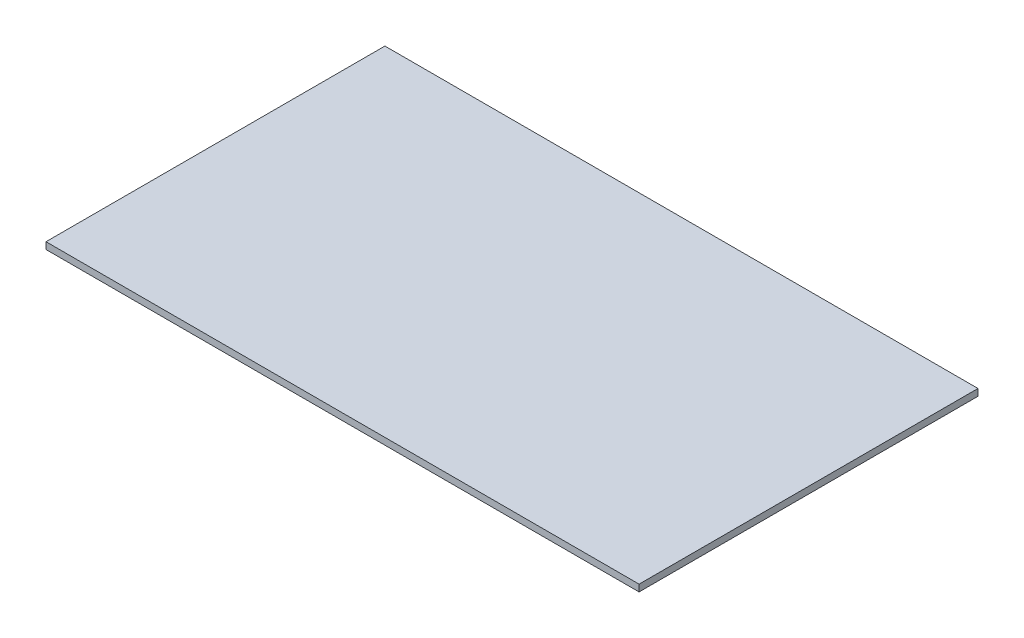
ISO-10303-21;
HEADER;
FILE_DESCRIPTION(('STEP AP214'),'2;1');
FILE_NAME('part.step','',(''),(''),'','','');
FILE_SCHEMA(('AUTOMOTIVE_DESIGN { 1 0 10303 214 1 1 1 1 }'));
ENDSEC;
DATA;
#1=APPLICATION_CONTEXT('core data for automotive mechanical design processes');
#2=APPLICATION_PROTOCOL_DEFINITION('international standard','automotive_design',2000,#1);
#3=PRODUCT_CONTEXT('',#1,'mechanical');
#4=PRODUCT('Part','Part','',(#3));
#5=PRODUCT_RELATED_PRODUCT_CATEGORY('part','',(#4));
#6=PRODUCT_DEFINITION_FORMATION('','',#4);
#7=PRODUCT_DEFINITION_CONTEXT('part definition',#1,'design');
#8=PRODUCT_DEFINITION('design','',#6,#7);
#9=PRODUCT_DEFINITION_SHAPE('','',#8);
#10=(LENGTH_UNIT() NAMED_UNIT(*) SI_UNIT(.MILLI.,.METRE.));
#11=(NAMED_UNIT(*) PLANE_ANGLE_UNIT() SI_UNIT($,.RADIAN.));
#12=(NAMED_UNIT(*) SI_UNIT($,.STERADIAN.) SOLID_ANGLE_UNIT());
#13=UNCERTAINTY_MEASURE_WITH_UNIT(LENGTH_MEASURE(1.E-05),#10,'distance_accuracy_value','');
#14=(GEOMETRIC_REPRESENTATION_CONTEXT(3) GLOBAL_UNCERTAINTY_ASSIGNED_CONTEXT((#13)) GLOBAL_UNIT_ASSIGNED_CONTEXT((#10,
#11,#12)) REPRESENTATION_CONTEXT('',''));
#15=CARTESIAN_POINT('',(0.,0.,0.));
#16=DIRECTION('',(0.,0.,1.));
#17=DIRECTION('',(1.,0.,0.));
#18=AXIS2_PLACEMENT_3D('',#15,#16,#17);
#19=CARTESIAN_POINT('',(-35.,0.8,-20.));
#20=DIRECTION('',(1.,0.,0.));
#21=DIRECTION('',(0.,0.,-1.));
#22=AXIS2_PLACEMENT_3D('',#19,#20,#21);
#23=PLANE('',#22);
#24=DIRECTION('',(0.,0.,1.));
#25=VECTOR('',#24,1.);
#26=CARTESIAN_POINT('',(-35.,0.,-20.));
#27=LINE('',#26,#25);
#28=CARTESIAN_POINT('',(-35.,0.,-20.));
#29=VERTEX_POINT('',#28);
#30=CARTESIAN_POINT('',(-35.,0.,20.));
#31=VERTEX_POINT('',#30);
#32=EDGE_CURVE('E101',#29,#31,#27,.T.);
#33=ORIENTED_EDGE('',*,*,#32,.T.);
#34=DIRECTION('',(0.,-1.,0.));
#35=VECTOR('',#34,1.);
#36=CARTESIAN_POINT('',(-35.,0.8,20.));
#37=LINE('',#36,#35);
#38=CARTESIAN_POINT('',(-35.,0.8,20.));
#39=VERTEX_POINT('',#38);
#40=EDGE_CURVE('E11',#39,#31,#37,.T.);
#41=ORIENTED_EDGE('',*,*,#40,.F.);
#42=DIRECTION('',(0.,0.,1.));
#43=VECTOR('',#42,1.);
#44=CARTESIAN_POINT('',(-35.,0.8,-20.));
#45=LINE('',#44,#43);
#46=CARTESIAN_POINT('',(-35.,0.8,-20.));
#47=VERTEX_POINT('',#46);
#48=EDGE_CURVE('E89',#47,#39,#45,.T.);
#49=ORIENTED_EDGE('',*,*,#48,.F.);
#50=DIRECTION('',(0.,-1.,0.));
#51=VECTOR('',#50,1.);
#52=CARTESIAN_POINT('',(-35.,0.8,-20.));
#53=LINE('',#52,#51);
#54=EDGE_CURVE('E97',#47,#29,#53,.T.);
#55=ORIENTED_EDGE('',*,*,#54,.T.);
#56=EDGE_LOOP('',(#33,#41,#49,#55));
#57=FACE_BOUND('',#56,.T.);
#58=ADVANCED_FACE('F38',(#57),#23,.F.);
#59=CARTESIAN_POINT('',(-35.,0.8,20.));
#60=DIRECTION('',(0.,0.,-1.));
#61=DIRECTION('',(-1.,0.,0.));
#62=AXIS2_PLACEMENT_3D('',#59,#60,#61);
#63=PLANE('',#62);
#64=DIRECTION('',(1.,0.,0.));
#65=VECTOR('',#64,1.);
#66=CARTESIAN_POINT('',(-35.,0.,20.));
#67=LINE('',#66,#65);
#68=CARTESIAN_POINT('',(35.,0.,20.));
#69=VERTEX_POINT('',#68);
#70=EDGE_CURVE('E93',#31,#69,#67,.T.);
#71=ORIENTED_EDGE('',*,*,#70,.T.);
#72=DIRECTION('',(0.,-1.,0.));
#73=VECTOR('',#72,1.);
#74=CARTESIAN_POINT('',(35.,0.8,20.));
#75=LINE('',#74,#73);
#76=CARTESIAN_POINT('',(35.,0.8,20.));
#77=VERTEX_POINT('',#76);
#78=EDGE_CURVE('E46',#77,#69,#75,.T.);
#79=ORIENTED_EDGE('',*,*,#78,.F.);
#80=DIRECTION('',(1.,0.,0.));
#81=VECTOR('',#80,1.);
#82=CARTESIAN_POINT('',(-35.,0.8,20.));
#83=LINE('',#82,#81);
#84=EDGE_CURVE('E84',#39,#77,#83,.T.);
#85=ORIENTED_EDGE('',*,*,#84,.F.);
#86=ORIENTED_EDGE('',*,*,#40,.T.);
#87=EDGE_LOOP('',(#71,#79,#85,#86));
#88=FACE_BOUND('',#87,.T.);
#89=ADVANCED_FACE('F92',(#88),#63,.F.);
#90=CARTESIAN_POINT('',(35.,0.8,-20.));
#91=DIRECTION('',(-1.,0.,0.));
#92=DIRECTION('',(0.,0.,1.));
#93=AXIS2_PLACEMENT_3D('',#90,#91,#92);
#94=PLANE('',#93);
#95=DIRECTION('',(0.,0.,-1.));
#96=VECTOR('',#95,1.);
#97=CARTESIAN_POINT('',(35.,0.,-20.));
#98=LINE('',#97,#96);
#99=CARTESIAN_POINT('',(35.,0.,-20.));
#100=VERTEX_POINT('',#99);
#101=EDGE_CURVE('E71',#69,#100,#98,.T.);
#102=ORIENTED_EDGE('',*,*,#101,.T.);
#103=DIRECTION('',(0.,-1.,0.));
#104=VECTOR('',#103,1.);
#105=CARTESIAN_POINT('',(35.,0.8,-20.));
#106=LINE('',#105,#104);
#107=CARTESIAN_POINT('',(35.,0.8,-20.));
#108=VERTEX_POINT('',#107);
#109=EDGE_CURVE('E94',#108,#100,#106,.T.);
#110=ORIENTED_EDGE('',*,*,#109,.F.);
#111=DIRECTION('',(0.,0.,-1.));
#112=VECTOR('',#111,1.);
#113=CARTESIAN_POINT('',(35.,0.8,-20.));
#114=LINE('',#113,#112);
#115=EDGE_CURVE('E87',#77,#108,#114,.T.);
#116=ORIENTED_EDGE('',*,*,#115,.F.);
#117=ORIENTED_EDGE('',*,*,#78,.T.);
#118=EDGE_LOOP('',(#102,#110,#116,#117));
#119=FACE_BOUND('',#118,.T.);
#120=ADVANCED_FACE('F95',(#119),#94,.F.);
#121=CARTESIAN_POINT('',(-35.,0.8,-20.));
#122=DIRECTION('',(0.,0.,1.));
#123=DIRECTION('',(1.,0.,0.));
#124=AXIS2_PLACEMENT_3D('',#121,#122,#123);
#125=PLANE('',#124);
#126=DIRECTION('',(-1.,0.,0.));
#127=VECTOR('',#126,1.);
#128=CARTESIAN_POINT('',(-35.,0.,-20.));
#129=LINE('',#128,#127);
#130=EDGE_CURVE('E77',#100,#29,#129,.T.);
#131=ORIENTED_EDGE('',*,*,#130,.T.);
#132=ORIENTED_EDGE('',*,*,#54,.F.);
#133=DIRECTION('',(-1.,0.,0.));
#134=VECTOR('',#133,1.);
#135=CARTESIAN_POINT('',(-35.,0.8,-20.));
#136=LINE('',#135,#134);
#137=EDGE_CURVE('E54',#108,#47,#136,.T.);
#138=ORIENTED_EDGE('',*,*,#137,.F.);
#139=ORIENTED_EDGE('',*,*,#109,.T.);
#140=EDGE_LOOP('',(#131,#132,#138,#139));
#141=FACE_BOUND('',#140,.T.);
#142=ADVANCED_FACE('F108',(#141),#125,.F.);
#143=CARTESIAN_POINT('',(0.,0.8,0.));
#144=DIRECTION('',(0.,1.,0.));
#145=DIRECTION('',(0.,0.,1.));
#146=AXIS2_PLACEMENT_3D('',#143,#144,#145);
#147=PLANE('',#146);
#148=ORIENTED_EDGE('',*,*,#48,.T.);
#149=ORIENTED_EDGE('',*,*,#84,.T.);
#150=ORIENTED_EDGE('',*,*,#115,.T.);
#151=ORIENTED_EDGE('',*,*,#137,.T.);
#152=EDGE_LOOP('',(#148,#149,#150,#151));
#153=FACE_BOUND('',#152,.T.);
#154=ADVANCED_FACE('F85',(#153),#147,.T.);
#155=CARTESIAN_POINT('',(0.,0.,0.));
#156=DIRECTION('',(0.,1.,0.));
#157=DIRECTION('',(0.,0.,1.));
#158=AXIS2_PLACEMENT_3D('',#155,#156,#157);
#159=PLANE('',#158);
#160=ORIENTED_EDGE('',*,*,#32,.F.);
#161=ORIENTED_EDGE('',*,*,#130,.F.);
#162=ORIENTED_EDGE('',*,*,#101,.F.);
#163=ORIENTED_EDGE('',*,*,#70,.F.);
#164=EDGE_LOOP('',(#160,#161,#162,#163));
#165=FACE_BOUND('',#164,.T.);
#166=ADVANCED_FACE('F111',(#165),#159,.F.);
#167=CLOSED_SHELL('',(#58,#89,#120,#142,#154,#166));
#168=MANIFOLD_SOLID_BREP('B2',#167);
#169=ADVANCED_BREP_SHAPE_REPRESENTATION('',(#18,#168),#14);
#170=SHAPE_DEFINITION_REPRESENTATION(#9,#169);
ENDSEC;
END-ISO-10303-21;
